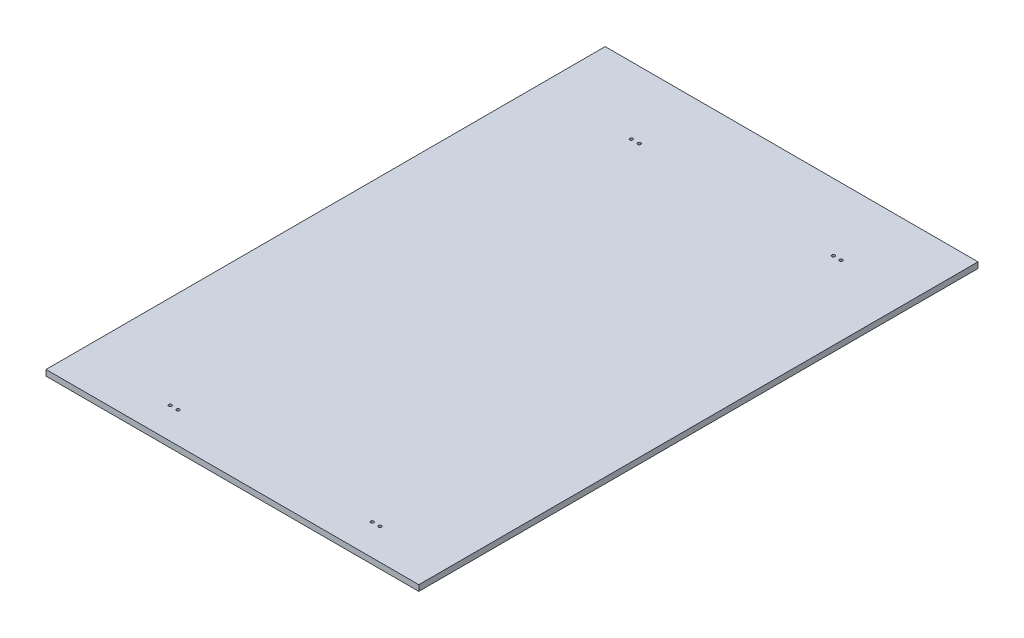
ISO-10303-21;
HEADER;
FILE_DESCRIPTION(('STEP AP214'),'2;1');
FILE_NAME('part.step','',(''),(''),'','','');
FILE_SCHEMA(('AUTOMOTIVE_DESIGN { 1 0 10303 214 1 1 1 1 }'));
ENDSEC;
DATA;
#1=APPLICATION_CONTEXT('core data for automotive mechanical design processes');
#2=APPLICATION_PROTOCOL_DEFINITION('international standard','automotive_design',2000,#1);
#3=PRODUCT_CONTEXT('',#1,'mechanical');
#4=PRODUCT('Part','Part','',(#3));
#5=PRODUCT_RELATED_PRODUCT_CATEGORY('part','',(#4));
#6=PRODUCT_DEFINITION_FORMATION('','',#4);
#7=PRODUCT_DEFINITION_CONTEXT('part definition',#1,'design');
#8=PRODUCT_DEFINITION('design','',#6,#7);
#9=PRODUCT_DEFINITION_SHAPE('','',#8);
#10=(LENGTH_UNIT() NAMED_UNIT(*) SI_UNIT(.MILLI.,.METRE.));
#11=(NAMED_UNIT(*) PLANE_ANGLE_UNIT() SI_UNIT($,.RADIAN.));
#12=(NAMED_UNIT(*) SI_UNIT($,.STERADIAN.) SOLID_ANGLE_UNIT());
#13=UNCERTAINTY_MEASURE_WITH_UNIT(LENGTH_MEASURE(1.E-05),#10,'distance_accuracy_value','');
#14=(GEOMETRIC_REPRESENTATION_CONTEXT(3) GLOBAL_UNCERTAINTY_ASSIGNED_CONTEXT((#13)) GLOBAL_UNIT_ASSIGNED_CONTEXT((#10,
#11,#12)) REPRESENTATION_CONTEXT('',''));
#15=CARTESIAN_POINT('',(0.,0.,0.));
#16=DIRECTION('',(0.,0.,1.));
#17=DIRECTION('',(1.,0.,0.));
#18=AXIS2_PLACEMENT_3D('',#15,#16,#17);
#19=CARTESIAN_POINT('',(609.6,19.05,-914.4));
#20=DIRECTION('',(-1.,0.,0.));
#21=DIRECTION('',(0.,0.,1.));
#22=AXIS2_PLACEMENT_3D('',#19,#20,#21);
#23=PLANE('',#22);
#24=DIRECTION('',(0.,0.,-1.));
#25=VECTOR('',#24,1.);
#26=CARTESIAN_POINT('',(609.6,0.,-914.4));
#27=LINE('',#26,#25);
#28=CARTESIAN_POINT('',(609.6,0.,914.4));
#29=VERTEX_POINT('',#28);
#30=CARTESIAN_POINT('',(609.6,0.,-914.4));
#31=VERTEX_POINT('',#30);
#32=EDGE_CURVE('E96',#29,#31,#27,.T.);
#33=ORIENTED_EDGE('',*,*,#32,.T.);
#34=DIRECTION('',(0.,-1.,0.));
#35=VECTOR('',#34,1.);
#36=CARTESIAN_POINT('',(609.6,19.05,-914.4));
#37=LINE('',#36,#35);
#38=CARTESIAN_POINT('',(609.6,19.05,-914.4));
#39=VERTEX_POINT('',#38);
#40=EDGE_CURVE('E11',#39,#31,#37,.T.);
#41=ORIENTED_EDGE('',*,*,#40,.F.);
#42=DIRECTION('',(0.,0.,-1.));
#43=VECTOR('',#42,1.);
#44=CARTESIAN_POINT('',(609.6,19.05,-914.4));
#45=LINE('',#44,#43);
#46=CARTESIAN_POINT('',(609.6,19.05,914.4));
#47=VERTEX_POINT('',#46);
#48=EDGE_CURVE('E84',#47,#39,#45,.T.);
#49=ORIENTED_EDGE('',*,*,#48,.F.);
#50=DIRECTION('',(0.,-1.,0.));
#51=VECTOR('',#50,1.);
#52=CARTESIAN_POINT('',(609.6,19.05,914.4));
#53=LINE('',#52,#51);
#54=EDGE_CURVE('E92',#47,#29,#53,.T.);
#55=ORIENTED_EDGE('',*,*,#54,.T.);
#56=EDGE_LOOP('',(#33,#41,#49,#55));
#57=FACE_BOUND('',#56,.T.);
#58=ADVANCED_FACE('F33',(#57),#23,.F.);
#59=CARTESIAN_POINT('',(-609.6,19.05,-914.4));
#60=DIRECTION('',(0.,0.,1.));
#61=DIRECTION('',(1.,0.,0.));
#62=AXIS2_PLACEMENT_3D('',#59,#60,#61);
#63=PLANE('',#62);
#64=DIRECTION('',(-1.,0.,0.));
#65=VECTOR('',#64,1.);
#66=CARTESIAN_POINT('',(-609.6,0.,-914.4));
#67=LINE('',#66,#65);
#68=CARTESIAN_POINT('',(-609.6,0.,-914.4));
#69=VERTEX_POINT('',#68);
#70=EDGE_CURVE('E88',#31,#69,#67,.T.);
#71=ORIENTED_EDGE('',*,*,#70,.T.);
#72=DIRECTION('',(0.,-1.,0.));
#73=VECTOR('',#72,1.);
#74=CARTESIAN_POINT('',(-609.6,19.05,-914.4));
#75=LINE('',#74,#73);
#76=CARTESIAN_POINT('',(-609.6,19.05,-914.4));
#77=VERTEX_POINT('',#76);
#78=EDGE_CURVE('E41',#77,#69,#75,.T.);
#79=ORIENTED_EDGE('',*,*,#78,.F.);
#80=DIRECTION('',(-1.,0.,0.));
#81=VECTOR('',#80,1.);
#82=CARTESIAN_POINT('',(-609.6,19.05,-914.4));
#83=LINE('',#82,#81);
#84=EDGE_CURVE('E79',#39,#77,#83,.T.);
#85=ORIENTED_EDGE('',*,*,#84,.F.);
#86=ORIENTED_EDGE('',*,*,#40,.T.);
#87=EDGE_LOOP('',(#71,#79,#85,#86));
#88=FACE_BOUND('',#87,.T.);
#89=ADVANCED_FACE('F87',(#88),#63,.F.);
#90=CARTESIAN_POINT('',(-609.6,19.05,-914.4));
#91=DIRECTION('',(1.,0.,0.));
#92=DIRECTION('',(0.,0.,-1.));
#93=AXIS2_PLACEMENT_3D('',#90,#91,#92);
#94=PLANE('',#93);
#95=DIRECTION('',(0.,0.,1.));
#96=VECTOR('',#95,1.);
#97=CARTESIAN_POINT('',(-609.6,0.,-914.4));
#98=LINE('',#97,#96);
#99=CARTESIAN_POINT('',(-609.6,0.,914.4));
#100=VERTEX_POINT('',#99);
#101=EDGE_CURVE('E66',#69,#100,#98,.T.);
#102=ORIENTED_EDGE('',*,*,#101,.T.);
#103=DIRECTION('',(0.,-1.,0.));
#104=VECTOR('',#103,1.);
#105=CARTESIAN_POINT('',(-609.6,19.05,914.4));
#106=LINE('',#105,#104);
#107=CARTESIAN_POINT('',(-609.6,19.05,914.4));
#108=VERTEX_POINT('',#107);
#109=EDGE_CURVE('E89',#108,#100,#106,.T.);
#110=ORIENTED_EDGE('',*,*,#109,.F.);
#111=DIRECTION('',(0.,0.,1.));
#112=VECTOR('',#111,1.);
#113=CARTESIAN_POINT('',(-609.6,19.05,-914.4));
#114=LINE('',#113,#112);
#115=EDGE_CURVE('E82',#77,#108,#114,.T.);
#116=ORIENTED_EDGE('',*,*,#115,.F.);
#117=ORIENTED_EDGE('',*,*,#78,.T.);
#118=EDGE_LOOP('',(#102,#110,#116,#117));
#119=FACE_BOUND('',#118,.T.);
#120=ADVANCED_FACE('F90',(#119),#94,.F.);
#121=CARTESIAN_POINT('',(-609.6,19.05,914.4));
#122=DIRECTION('',(0.,0.,-1.));
#123=DIRECTION('',(-1.,0.,0.));
#124=AXIS2_PLACEMENT_3D('',#121,#122,#123);
#125=PLANE('',#124);
#126=DIRECTION('',(1.,0.,0.));
#127=VECTOR('',#126,1.);
#128=CARTESIAN_POINT('',(-609.6,0.,914.4));
#129=LINE('',#128,#127);
#130=EDGE_CURVE('E72',#100,#29,#129,.T.);
#131=ORIENTED_EDGE('',*,*,#130,.T.);
#132=ORIENTED_EDGE('',*,*,#54,.F.);
#133=DIRECTION('',(1.,0.,0.));
#134=VECTOR('',#133,1.);
#135=CARTESIAN_POINT('',(-609.6,19.05,914.4));
#136=LINE('',#135,#134);
#137=EDGE_CURVE('E49',#108,#47,#136,.T.);
#138=ORIENTED_EDGE('',*,*,#137,.F.);
#139=ORIENTED_EDGE('',*,*,#109,.T.);
#140=EDGE_LOOP('',(#131,#132,#138,#139));
#141=FACE_BOUND('',#140,.T.);
#142=ADVANCED_FACE('F104',(#141),#125,.F.);
#143=CARTESIAN_POINT('',(0.,19.05,0.));
#144=DIRECTION('',(0.,1.,0.));
#145=DIRECTION('',(0.,0.,1.));
#146=AXIS2_PLACEMENT_3D('',#143,#144,#145);
#147=PLANE('',#146);
#148=CARTESIAN_POINT('',(-304.8,19.05,-695.2996));
#149=DIRECTION('',(0.,1.,0.));
#150=DIRECTION('',(0.,0.,1.));
#151=AXIS2_PLACEMENT_3D('',#148,#149,#150);
#152=CIRCLE('',#151,5.04189999999999);
#153=CARTESIAN_POINT('',(-304.8,19.05,-690.2577));
#154=VERTEX_POINT('',#153);
#155=EDGE_CURVE('E154',#154,#154,#152,.T.);
#156=ORIENTED_EDGE('',*,*,#155,.F.);
#157=EDGE_LOOP('',(#156));
#158=FACE_BOUND('',#157,.T.);
#159=CARTESIAN_POINT('',(381.,19.05,812.8));
#160=DIRECTION('',(0.,1.,0.));
#161=DIRECTION('',(0.,0.,1.));
#162=AXIS2_PLACEMENT_3D('',#159,#160,#161);
#163=CIRCLE('',#162,5.04189999999999);
#164=CARTESIAN_POINT('',(381.,19.05,817.8419));
#165=VERTEX_POINT('',#164);
#166=EDGE_CURVE('E148',#165,#165,#163,.T.);
#167=ORIENTED_EDGE('',*,*,#166,.F.);
#168=EDGE_LOOP('',(#167));
#169=FACE_BOUND('',#168,.T.);
#170=CARTESIAN_POINT('',(-304.799999999999,19.05,812.8));
#171=DIRECTION('',(0.,1.,0.));
#172=DIRECTION('',(0.,0.,1.));
#173=AXIS2_PLACEMENT_3D('',#170,#171,#172);
#174=CIRCLE('',#173,5.04189999999999);
#175=CARTESIAN_POINT('',(-304.799999999999,19.05,817.8419));
#176=VERTEX_POINT('',#175);
#177=EDGE_CURVE('E142',#176,#176,#174,.T.);
#178=ORIENTED_EDGE('',*,*,#177,.F.);
#179=EDGE_LOOP('',(#178));
#180=FACE_BOUND('',#179,.T.);
#181=CARTESIAN_POINT('',(381.,19.05,-695.2996));
#182=DIRECTION('',(0.,1.,0.));
#183=DIRECTION('',(0.,0.,1.));
#184=AXIS2_PLACEMENT_3D('',#181,#182,#183);
#185=CIRCLE('',#184,5.04189999999999);
#186=CARTESIAN_POINT('',(381.,19.05,-690.2577));
#187=VERTEX_POINT('',#186);
#188=EDGE_CURVE('E136',#187,#187,#185,.T.);
#189=ORIENTED_EDGE('',*,*,#188,.F.);
#190=EDGE_LOOP('',(#189));
#191=FACE_BOUND('',#190,.T.);
#192=CARTESIAN_POINT('',(355.6,19.05,812.8));
#193=DIRECTION('',(0.,1.,0.));
#194=DIRECTION('',(0.,0.,1.));
#195=AXIS2_PLACEMENT_3D('',#192,#193,#194);
#196=CIRCLE('',#195,5.04189999999999);
#197=CARTESIAN_POINT('',(355.6,19.05,817.8419));
#198=VERTEX_POINT('',#197);
#199=EDGE_CURVE('E130',#198,#198,#196,.T.);
#200=ORIENTED_EDGE('',*,*,#199,.F.);
#201=EDGE_LOOP('',(#200));
#202=FACE_BOUND('',#201,.T.);
#203=CARTESIAN_POINT('',(-279.4,19.05,812.8));
#204=DIRECTION('',(0.,1.,0.));
#205=DIRECTION('',(0.,0.,1.));
#206=AXIS2_PLACEMENT_3D('',#203,#204,#205);
#207=CIRCLE('',#206,5.04189999999999);
#208=CARTESIAN_POINT('',(-279.4,19.05,817.8419));
#209=VERTEX_POINT('',#208);
#210=EDGE_CURVE('E124',#209,#209,#207,.T.);
#211=ORIENTED_EDGE('',*,*,#210,.F.);
#212=EDGE_LOOP('',(#211));
#213=FACE_BOUND('',#212,.T.);
#214=CARTESIAN_POINT('',(-279.4,19.05,-695.2996));
#215=DIRECTION('',(0.,1.,0.));
#216=DIRECTION('',(0.,0.,1.));
#217=AXIS2_PLACEMENT_3D('',#214,#215,#216);
#218=CIRCLE('',#217,5.04189999999999);
#219=CARTESIAN_POINT('',(-279.4,19.05,-690.2577));
#220=VERTEX_POINT('',#219);
#221=EDGE_CURVE('E118',#220,#220,#218,.T.);
#222=ORIENTED_EDGE('',*,*,#221,.F.);
#223=EDGE_LOOP('',(#222));
#224=FACE_BOUND('',#223,.T.);
#225=CARTESIAN_POINT('',(355.6,19.05,-695.2996));
#226=DIRECTION('',(0.,1.,0.));
#227=DIRECTION('',(0.,0.,1.));
#228=AXIS2_PLACEMENT_3D('',#225,#226,#227);
#229=CIRCLE('',#228,5.04189999999999);
#230=CARTESIAN_POINT('',(355.6,19.05,-690.2577));
#231=VERTEX_POINT('',#230);
#232=EDGE_CURVE('E112',#231,#231,#229,.T.);
#233=ORIENTED_EDGE('',*,*,#232,.F.);
#234=EDGE_LOOP('',(#233));
#235=FACE_BOUND('',#234,.T.);
#236=ORIENTED_EDGE('',*,*,#48,.T.);
#237=ORIENTED_EDGE('',*,*,#84,.T.);
#238=ORIENTED_EDGE('',*,*,#115,.T.);
#239=ORIENTED_EDGE('',*,*,#137,.T.);
#240=EDGE_LOOP('',(#236,#237,#238,#239));
#241=FACE_BOUND('',#240,.T.);
#242=ADVANCED_FACE('F80',(#158,#169,#180,#191,#202,#213,#224,#235,#241),#147,.T.);
#243=CARTESIAN_POINT('',(0.,0.,0.));
#244=DIRECTION('',(0.,1.,0.));
#245=DIRECTION('',(0.,0.,1.));
#246=AXIS2_PLACEMENT_3D('',#243,#244,#245);
#247=PLANE('',#246);
#248=CARTESIAN_POINT('',(-304.8,0.,-695.2996));
#249=DIRECTION('',(0.,1.,0.));
#250=DIRECTION('',(0.,0.,1.));
#251=AXIS2_PLACEMENT_3D('',#248,#249,#250);
#252=CIRCLE('',#251,5.04189999999999);
#253=CARTESIAN_POINT('',(-304.8,0.,-690.2577));
#254=VERTEX_POINT('',#253);
#255=EDGE_CURVE('E151',#254,#254,#252,.T.);
#256=ORIENTED_EDGE('',*,*,#255,.T.);
#257=EDGE_LOOP('',(#256));
#258=FACE_BOUND('',#257,.T.);
#259=CARTESIAN_POINT('',(381.,0.,812.8));
#260=DIRECTION('',(0.,1.,0.));
#261=DIRECTION('',(0.,0.,1.));
#262=AXIS2_PLACEMENT_3D('',#259,#260,#261);
#263=CIRCLE('',#262,5.04189999999999);
#264=CARTESIAN_POINT('',(381.,0.,817.8419));
#265=VERTEX_POINT('',#264);
#266=EDGE_CURVE('E145',#265,#265,#263,.T.);
#267=ORIENTED_EDGE('',*,*,#266,.T.);
#268=EDGE_LOOP('',(#267));
#269=FACE_BOUND('',#268,.T.);
#270=CARTESIAN_POINT('',(-304.799999999999,0.,812.8));
#271=DIRECTION('',(0.,1.,0.));
#272=DIRECTION('',(0.,0.,1.));
#273=AXIS2_PLACEMENT_3D('',#270,#271,#272);
#274=CIRCLE('',#273,5.04189999999999);
#275=CARTESIAN_POINT('',(-304.799999999999,0.,817.8419));
#276=VERTEX_POINT('',#275);
#277=EDGE_CURVE('E139',#276,#276,#274,.T.);
#278=ORIENTED_EDGE('',*,*,#277,.T.);
#279=EDGE_LOOP('',(#278));
#280=FACE_BOUND('',#279,.T.);
#281=CARTESIAN_POINT('',(381.,0.,-695.2996));
#282=DIRECTION('',(0.,1.,0.));
#283=DIRECTION('',(0.,0.,1.));
#284=AXIS2_PLACEMENT_3D('',#281,#282,#283);
#285=CIRCLE('',#284,5.04189999999999);
#286=CARTESIAN_POINT('',(381.,0.,-690.2577));
#287=VERTEX_POINT('',#286);
#288=EDGE_CURVE('E133',#287,#287,#285,.T.);
#289=ORIENTED_EDGE('',*,*,#288,.T.);
#290=EDGE_LOOP('',(#289));
#291=FACE_BOUND('',#290,.T.);
#292=CARTESIAN_POINT('',(355.6,0.,812.8));
#293=DIRECTION('',(0.,1.,0.));
#294=DIRECTION('',(0.,0.,1.));
#295=AXIS2_PLACEMENT_3D('',#292,#293,#294);
#296=CIRCLE('',#295,5.04189999999999);
#297=CARTESIAN_POINT('',(355.6,0.,817.8419));
#298=VERTEX_POINT('',#297);
#299=EDGE_CURVE('E127',#298,#298,#296,.T.);
#300=ORIENTED_EDGE('',*,*,#299,.T.);
#301=EDGE_LOOP('',(#300));
#302=FACE_BOUND('',#301,.T.);
#303=CARTESIAN_POINT('',(-279.4,0.,812.8));
#304=DIRECTION('',(0.,1.,0.));
#305=DIRECTION('',(0.,0.,1.));
#306=AXIS2_PLACEMENT_3D('',#303,#304,#305);
#307=CIRCLE('',#306,5.04189999999999);
#308=CARTESIAN_POINT('',(-279.4,0.,817.8419));
#309=VERTEX_POINT('',#308);
#310=EDGE_CURVE('E121',#309,#309,#307,.T.);
#311=ORIENTED_EDGE('',*,*,#310,.T.);
#312=EDGE_LOOP('',(#311));
#313=FACE_BOUND('',#312,.T.);
#314=CARTESIAN_POINT('',(-279.4,0.,-695.2996));
#315=DIRECTION('',(0.,1.,0.));
#316=DIRECTION('',(0.,0.,1.));
#317=AXIS2_PLACEMENT_3D('',#314,#315,#316);
#318=CIRCLE('',#317,5.04189999999999);
#319=CARTESIAN_POINT('',(-279.4,0.,-690.2577));
#320=VERTEX_POINT('',#319);
#321=EDGE_CURVE('E115',#320,#320,#318,.T.);
#322=ORIENTED_EDGE('',*,*,#321,.T.);
#323=EDGE_LOOP('',(#322));
#324=FACE_BOUND('',#323,.T.);
#325=CARTESIAN_POINT('',(355.6,0.,-695.2996));
#326=DIRECTION('',(0.,1.,0.));
#327=DIRECTION('',(0.,0.,1.));
#328=AXIS2_PLACEMENT_3D('',#325,#326,#327);
#329=CIRCLE('',#328,5.04189999999999);
#330=CARTESIAN_POINT('',(355.6,0.,-690.2577));
#331=VERTEX_POINT('',#330);
#332=EDGE_CURVE('E99',#331,#331,#329,.T.);
#333=ORIENTED_EDGE('',*,*,#332,.T.);
#334=EDGE_LOOP('',(#333));
#335=FACE_BOUND('',#334,.T.);
#336=ORIENTED_EDGE('',*,*,#32,.F.);
#337=ORIENTED_EDGE('',*,*,#130,.F.);
#338=ORIENTED_EDGE('',*,*,#101,.F.);
#339=ORIENTED_EDGE('',*,*,#70,.F.);
#340=EDGE_LOOP('',(#336,#337,#338,#339));
#341=FACE_BOUND('',#340,.T.);
#342=ADVANCED_FACE('F107',(#258,#269,#280,#291,#302,#313,#324,#335,#341),#247,.F.);
#343=CARTESIAN_POINT('',(355.6,19.05,-695.2996));
#344=DIRECTION('',(0.,1.,0.));
#345=DIRECTION('',(0.,0.,1.));
#346=AXIS2_PLACEMENT_3D('',#343,#344,#345);
#347=CYLINDRICAL_SURFACE('',#346,5.04189999999999);
#348=ORIENTED_EDGE('',*,*,#332,.F.);
#349=EDGE_LOOP('',(#348));
#350=FACE_BOUND('',#349,.T.);
#351=ORIENTED_EDGE('',*,*,#232,.T.);
#352=EDGE_LOOP('',(#351));
#353=FACE_BOUND('',#352,.T.);
#354=ADVANCED_FACE('F177',(#350,#353),#347,.F.);
#355=CARTESIAN_POINT('',(-279.4,19.05,-695.2996));
#356=DIRECTION('',(0.,1.,0.));
#357=DIRECTION('',(0.,0.,1.));
#358=AXIS2_PLACEMENT_3D('',#355,#356,#357);
#359=CYLINDRICAL_SURFACE('',#358,5.04189999999999);
#360=ORIENTED_EDGE('',*,*,#321,.F.);
#361=EDGE_LOOP('',(#360));
#362=FACE_BOUND('',#361,.T.);
#363=ORIENTED_EDGE('',*,*,#221,.T.);
#364=EDGE_LOOP('',(#363));
#365=FACE_BOUND('',#364,.T.);
#366=ADVANCED_FACE('F179',(#362,#365),#359,.F.);
#367=CARTESIAN_POINT('',(-279.4,19.05,812.8));
#368=DIRECTION('',(0.,1.,0.));
#369=DIRECTION('',(0.,0.,1.));
#370=AXIS2_PLACEMENT_3D('',#367,#368,#369);
#371=CYLINDRICAL_SURFACE('',#370,5.04189999999999);
#372=ORIENTED_EDGE('',*,*,#310,.F.);
#373=EDGE_LOOP('',(#372));
#374=FACE_BOUND('',#373,.T.);
#375=ORIENTED_EDGE('',*,*,#210,.T.);
#376=EDGE_LOOP('',(#375));
#377=FACE_BOUND('',#376,.T.);
#378=ADVANCED_FACE('F186',(#374,#377),#371,.F.);
#379=CARTESIAN_POINT('',(355.6,19.05,812.8));
#380=DIRECTION('',(0.,1.,0.));
#381=DIRECTION('',(0.,0.,1.));
#382=AXIS2_PLACEMENT_3D('',#379,#380,#381);
#383=CYLINDRICAL_SURFACE('',#382,5.04189999999999);
#384=ORIENTED_EDGE('',*,*,#299,.F.);
#385=EDGE_LOOP('',(#384));
#386=FACE_BOUND('',#385,.T.);
#387=ORIENTED_EDGE('',*,*,#199,.T.);
#388=EDGE_LOOP('',(#387));
#389=FACE_BOUND('',#388,.T.);
#390=ADVANCED_FACE('F235',(#386,#389),#383,.F.);
#391=CARTESIAN_POINT('',(381.,19.05,-695.2996));
#392=DIRECTION('',(0.,1.,0.));
#393=DIRECTION('',(0.,0.,1.));
#394=AXIS2_PLACEMENT_3D('',#391,#392,#393);
#395=CYLINDRICAL_SURFACE('',#394,5.04189999999999);
#396=ORIENTED_EDGE('',*,*,#288,.F.);
#397=EDGE_LOOP('',(#396));
#398=FACE_BOUND('',#397,.T.);
#399=ORIENTED_EDGE('',*,*,#188,.T.);
#400=EDGE_LOOP('',(#399));
#401=FACE_BOUND('',#400,.T.);
#402=ADVANCED_FACE('F245',(#398,#401),#395,.F.);
#403=CARTESIAN_POINT('',(-304.799999999999,19.05,812.8));
#404=DIRECTION('',(0.,1.,0.));
#405=DIRECTION('',(0.,0.,1.));
#406=AXIS2_PLACEMENT_3D('',#403,#404,#405);
#407=CYLINDRICAL_SURFACE('',#406,5.04189999999999);
#408=ORIENTED_EDGE('',*,*,#277,.F.);
#409=EDGE_LOOP('',(#408));
#410=FACE_BOUND('',#409,.T.);
#411=ORIENTED_EDGE('',*,*,#177,.T.);
#412=EDGE_LOOP('',(#411));
#413=FACE_BOUND('',#412,.T.);
#414=ADVANCED_FACE('F255',(#410,#413),#407,.F.);
#415=CARTESIAN_POINT('',(381.,19.05,812.8));
#416=DIRECTION('',(0.,1.,0.));
#417=DIRECTION('',(0.,0.,1.));
#418=AXIS2_PLACEMENT_3D('',#415,#416,#417);
#419=CYLINDRICAL_SURFACE('',#418,5.04189999999999);
#420=ORIENTED_EDGE('',*,*,#266,.F.);
#421=EDGE_LOOP('',(#420));
#422=FACE_BOUND('',#421,.T.);
#423=ORIENTED_EDGE('',*,*,#166,.T.);
#424=EDGE_LOOP('',(#423));
#425=FACE_BOUND('',#424,.T.);
#426=ADVANCED_FACE('F265',(#422,#425),#419,.F.);
#427=CARTESIAN_POINT('',(-304.8,19.05,-695.2996));
#428=DIRECTION('',(0.,1.,0.));
#429=DIRECTION('',(0.,0.,1.));
#430=AXIS2_PLACEMENT_3D('',#427,#428,#429);
#431=CYLINDRICAL_SURFACE('',#430,5.04189999999999);
#432=ORIENTED_EDGE('',*,*,#255,.F.);
#433=EDGE_LOOP('',(#432));
#434=FACE_BOUND('',#433,.T.);
#435=ORIENTED_EDGE('',*,*,#155,.T.);
#436=EDGE_LOOP('',(#435));
#437=FACE_BOUND('',#436,.T.);
#438=ADVANCED_FACE('F158',(#434,#437),#431,.F.);
#439=CLOSED_SHELL('',(#58,#89,#120,#142,#242,#342,#354,#366,#378,#390,#402,#414,#426,#438));
#440=MANIFOLD_SOLID_BREP('B2',#439);
#441=ADVANCED_BREP_SHAPE_REPRESENTATION('',(#18,#440),#14);
#442=SHAPE_DEFINITION_REPRESENTATION(#9,#441);
ENDSEC;
END-ISO-10303-21;
